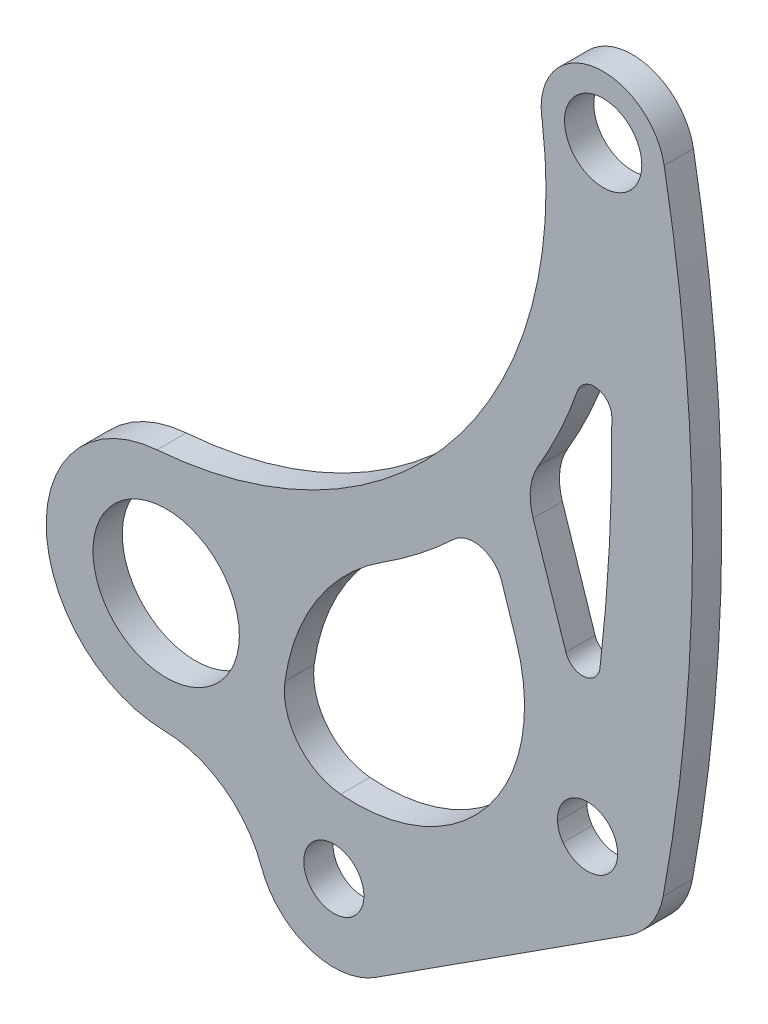
ISO-10303-21;
HEADER;
FILE_DESCRIPTION(('STEP AP214'),'2;1');
FILE_NAME('part.step','',(''),(''),'','','');
FILE_SCHEMA(('AUTOMOTIVE_DESIGN { 1 0 10303 214 1 1 1 1 }'));
ENDSEC;
DATA;
#1=APPLICATION_CONTEXT('core data for automotive mechanical design processes');
#2=APPLICATION_PROTOCOL_DEFINITION('international standard','automotive_design',2000,#1);
#3=PRODUCT_CONTEXT('',#1,'mechanical');
#4=PRODUCT('Part','Part','',(#3));
#5=PRODUCT_RELATED_PRODUCT_CATEGORY('part','',(#4));
#6=PRODUCT_DEFINITION_FORMATION('','',#4);
#7=PRODUCT_DEFINITION_CONTEXT('part definition',#1,'design');
#8=PRODUCT_DEFINITION('design','',#6,#7);
#9=PRODUCT_DEFINITION_SHAPE('','',#8);
#10=(LENGTH_UNIT() NAMED_UNIT(*) SI_UNIT(.MILLI.,.METRE.));
#11=(NAMED_UNIT(*) PLANE_ANGLE_UNIT() SI_UNIT($,.RADIAN.));
#12=(NAMED_UNIT(*) SI_UNIT($,.STERADIAN.) SOLID_ANGLE_UNIT());
#13=UNCERTAINTY_MEASURE_WITH_UNIT(LENGTH_MEASURE(1.E-05),#10,'distance_accuracy_value','');
#14=(GEOMETRIC_REPRESENTATION_CONTEXT(3) GLOBAL_UNCERTAINTY_ASSIGNED_CONTEXT((#13)) GLOBAL_UNIT_ASSIGNED_CONTEXT((#10,
#11,#12)) REPRESENTATION_CONTEXT('',''));
#15=CARTESIAN_POINT('',(0.,0.,0.));
#16=DIRECTION('',(0.,0.,1.));
#17=DIRECTION('',(1.,0.,0.));
#18=AXIS2_PLACEMENT_3D('',#15,#16,#17);
#19=CARTESIAN_POINT('',(-4.50533240745612,58.5644592406378,3.175));
#20=DIRECTION('',(0.,0.,-1.));
#21=DIRECTION('',(-1.,0.,0.));
#22=AXIS2_PLACEMENT_3D('',#19,#20,#21);
#23=CYLINDRICAL_SURFACE('',#22,52.07);
#24=CARTESIAN_POINT('',(-4.50533240745612,58.5644592406378,0.));
#25=DIRECTION('',(0.,0.,1.));
#26=DIRECTION('',(1.,0.,0.));
#27=AXIS2_PLACEMENT_3D('',#24,#25,#26);
#28=CIRCLE('',#27,52.07);
#29=CARTESIAN_POINT('',(23.480081983868,14.6543068684828,0.));
#30=VERTEX_POINT('',#29);
#31=CARTESIAN_POINT('',(31.2033161381692,20.667529034551,0.));
#32=VERTEX_POINT('',#31);
#33=EDGE_CURVE('E382',#30,#32,#28,.T.);
#34=ORIENTED_EDGE('',*,*,#33,.T.);
#35=DIRECTION('',(0.,0.,-1.));
#36=VECTOR('',#35,1.);
#37=CARTESIAN_POINT('',(31.2033161381692,20.667529034551,3.175));
#38=LINE('',#37,#36);
#39=CARTESIAN_POINT('',(31.2033161381692,20.667529034551,3.175));
#40=VERTEX_POINT('',#39);
#41=EDGE_CURVE('E79',#32,#40,#38,.F.);
#42=ORIENTED_EDGE('',*,*,#41,.T.);
#43=CARTESIAN_POINT('',(-4.50533240745612,58.5644592406378,3.175));
#44=DIRECTION('',(0.,0.,1.));
#45=DIRECTION('',(1.,0.,0.));
#46=AXIS2_PLACEMENT_3D('',#43,#44,#45);
#47=CIRCLE('',#46,52.07);
#48=CARTESIAN_POINT('',(23.480081983868,14.6543068684828,3.175));
#49=VERTEX_POINT('',#48);
#50=EDGE_CURVE('E327',#49,#40,#47,.T.);
#51=ORIENTED_EDGE('',*,*,#50,.F.);
#52=DIRECTION('',(0.,0.,1.));
#53=VECTOR('',#52,1.);
#54=CARTESIAN_POINT('',(23.480081983868,14.6543068684828,0.));
#55=LINE('',#54,#53);
#56=EDGE_CURVE('E262',#30,#49,#55,.T.);
#57=ORIENTED_EDGE('',*,*,#56,.F.);
#58=EDGE_LOOP('',(#34,#42,#51,#57));
#59=FACE_BOUND('',#58,.T.);
#60=ADVANCED_FACE('F55',(#59),#23,.T.);
#61=CARTESIAN_POINT('',(45.72,0.,3.175));
#62=DIRECTION('',(0.,0.,-1.));
#63=DIRECTION('',(-1.,0.,0.));
#64=AXIS2_PLACEMENT_3D('',#61,#62,#63);
#65=CYLINDRICAL_SURFACE('',#64,3.2639);
#66=CARTESIAN_POINT('',(45.72,0.,0.));
#67=DIRECTION('',(0.,0.,1.));
#68=DIRECTION('',(1.,0.,0.));
#69=AXIS2_PLACEMENT_3D('',#66,#67,#68);
#70=CIRCLE('',#69,3.2639);
#71=CARTESIAN_POINT('',(42.4625763798194,-0.205510507492002,0.));
#72=VERTEX_POINT('',#71);
#73=CARTESIAN_POINT('',(43.0519360241002,-1.88002069948861,0.));
#74=VERTEX_POINT('',#73);
#75=EDGE_CURVE('E399',#72,#74,#70,.T.);
#76=ORIENTED_EDGE('',*,*,#75,.F.);
#77=DIRECTION('',(0.,0.,1.));
#78=VECTOR('',#77,1.);
#79=CARTESIAN_POINT('',(42.4625763798194,-0.205510507492002,3.175));
#80=LINE('',#79,#78);
#81=CARTESIAN_POINT('',(42.4625763798194,-0.205510507492002,3.175));
#82=VERTEX_POINT('',#81);
#83=EDGE_CURVE('E442',#72,#82,#80,.T.);
#84=ORIENTED_EDGE('',*,*,#83,.T.);
#85=CARTESIAN_POINT('',(45.72,0.,3.175));
#86=DIRECTION('',(0.,0.,1.));
#87=DIRECTION('',(1.,0.,0.));
#88=AXIS2_PLACEMENT_3D('',#85,#86,#87);
#89=CIRCLE('',#88,3.2639);
#90=CARTESIAN_POINT('',(43.0519360241002,-1.88002069948861,3.175));
#91=VERTEX_POINT('',#90);
#92=EDGE_CURVE('E345',#82,#91,#89,.T.);
#93=ORIENTED_EDGE('',*,*,#92,.T.);
#94=DIRECTION('',(0.,0.,1.));
#95=VECTOR('',#94,1.);
#96=CARTESIAN_POINT('',(43.0519360241002,-1.88002069948861,3.175));
#97=LINE('',#96,#95);
#98=EDGE_CURVE('E431',#74,#91,#97,.T.);
#99=ORIENTED_EDGE('',*,*,#98,.F.);
#100=EDGE_LOOP('',(#76,#84,#93,#99));
#101=FACE_BOUND('',#100,.T.);
#102=ADVANCED_FACE('F531',(#101),#65,.F.);
#103=CARTESIAN_POINT('',(48.9774236201806,0.205510507492002,3.175));
#104=VERTEX_POINT('',#103);
#105=EDGE_CURVE('E346',#91,#104,#89,.T.);
#106=ORIENTED_EDGE('',*,*,#105,.T.);
#107=DIRECTION('',(0.,0.,-1.));
#108=VECTOR('',#107,1.);
#109=CARTESIAN_POINT('',(48.9774236201806,0.205510507492002,3.175));
#110=LINE('',#109,#108);
#111=CARTESIAN_POINT('',(48.9774236201806,0.205510507492002,0.));
#112=VERTEX_POINT('',#111);
#113=EDGE_CURVE('E439',#104,#112,#110,.T.);
#114=ORIENTED_EDGE('',*,*,#113,.T.);
#115=EDGE_CURVE('E400',#74,#112,#70,.T.);
#116=ORIENTED_EDGE('',*,*,#115,.F.);
#117=ORIENTED_EDGE('',*,*,#98,.T.);
#118=EDGE_LOOP('',(#106,#114,#116,#117));
#119=FACE_BOUND('',#118,.T.);
#120=ADVANCED_FACE('F538',(#119),#65,.F.);
#121=ORIENTED_EDGE('',*,*,#113,.F.);
#122=CARTESIAN_POINT('',(48.3880639758998,1.88002069948861,3.175));
#123=VERTEX_POINT('',#122);
#124=EDGE_CURVE('E351',#104,#123,#89,.T.);
#125=ORIENTED_EDGE('',*,*,#124,.T.);
#126=DIRECTION('',(0.,0.,-1.));
#127=VECTOR('',#126,1.);
#128=CARTESIAN_POINT('',(48.3880639758998,1.88002069948861,3.175));
#129=LINE('',#128,#127);
#130=CARTESIAN_POINT('',(48.3880639758998,1.88002069948861,0.));
#131=VERTEX_POINT('',#130);
#132=EDGE_CURVE('E435',#123,#131,#129,.T.);
#133=ORIENTED_EDGE('',*,*,#132,.T.);
#134=EDGE_CURVE('E405',#112,#131,#70,.T.);
#135=ORIENTED_EDGE('',*,*,#134,.F.);
#136=EDGE_LOOP('',(#121,#125,#133,#135));
#137=FACE_BOUND('',#136,.T.);
#138=ADVANCED_FACE('F546',(#137),#65,.F.);
#139=CARTESIAN_POINT('',(40.3709543283503,32.1560554871792,3.175));
#140=VERTEX_POINT('',#139);
#141=CARTESIAN_POINT('',(44.646607754843,41.3780786361658,3.175));
#142=VERTEX_POINT('',#141);
#143=EDGE_CURVE('E331',#140,#142,#47,.T.);
#144=ORIENTED_EDGE('',*,*,#143,.F.);
#145=DIRECTION('',(0.,0.,-1.));
#146=VECTOR('',#145,1.);
#147=CARTESIAN_POINT('',(40.3709543283503,32.1560554871792,3.175));
#148=LINE('',#147,#146);
#149=CARTESIAN_POINT('',(40.3709543283503,32.1560554871792,0.));
#150=VERTEX_POINT('',#149);
#151=EDGE_CURVE('E475',#140,#150,#148,.T.);
#152=ORIENTED_EDGE('',*,*,#151,.T.);
#153=CARTESIAN_POINT('',(44.646607754843,41.3780786361658,0.));
#154=VERTEX_POINT('',#153);
#155=EDGE_CURVE('E386',#150,#154,#28,.T.);
#156=ORIENTED_EDGE('',*,*,#155,.T.);
#157=DIRECTION('',(0.,0.,-1.));
#158=VECTOR('',#157,1.);
#159=CARTESIAN_POINT('',(44.646607754843,41.3780786361658,3.175));
#160=LINE('',#159,#158);
#161=EDGE_CURVE('E457',#154,#142,#160,.F.);
#162=ORIENTED_EDGE('',*,*,#161,.T.);
#163=EDGE_LOOP('',(#144,#152,#156,#162));
#164=FACE_BOUND('',#163,.T.);
#165=ADVANCED_FACE('F533',(#164),#23,.T.);
#166=CARTESIAN_POINT('',(-142.138533342949,38.656045003802,3.175));
#167=DIRECTION('',(0.,0.,-1.));
#168=DIRECTION('',(-1.,0.,0.));
#169=AXIS2_PLACEMENT_3D('',#166,#167,#168);
#170=CYLINDRICAL_SURFACE('',#169,190.5);
#171=CARTESIAN_POINT('',(-142.138533342949,38.656045003802,0.));
#172=DIRECTION('',(0.,0.,1.));
#173=DIRECTION('',(1.,0.,0.));
#174=AXIS2_PLACEMENT_3D('',#171,#172,#173);
#175=CIRCLE('',#174,190.5);
#176=CARTESIAN_POINT('',(47.0702030784157,16.5132343910918,0.));
#177=VERTEX_POINT('',#176);
#178=CARTESIAN_POINT('',(48.3497321227549,40.7704526909221,0.));
#179=VERTEX_POINT('',#178);
#180=EDGE_CURVE('E393',#177,#179,#175,.T.);
#181=ORIENTED_EDGE('',*,*,#180,.F.);
#182=DIRECTION('',(0.,0.,-1.));
#183=VECTOR('',#182,1.);
#184=CARTESIAN_POINT('',(47.0702030784158,16.5132343910918,3.175));
#185=LINE('',#184,#183);
#186=CARTESIAN_POINT('',(47.0702030784157,16.5132343910918,3.175));
#187=VERTEX_POINT('',#186);
#188=EDGE_CURVE('E454',#177,#187,#185,.F.);
#189=ORIENTED_EDGE('',*,*,#188,.T.);
#190=CARTESIAN_POINT('',(-142.138533342949,38.656045003802,3.175));
#191=DIRECTION('',(0.,0.,1.));
#192=DIRECTION('',(1.,0.,0.));
#193=AXIS2_PLACEMENT_3D('',#190,#191,#192);
#194=CIRCLE('',#193,190.5);
#195=CARTESIAN_POINT('',(48.3497321227549,40.7704526909221,3.175));
#196=VERTEX_POINT('',#195);
#197=EDGE_CURVE('E338',#187,#196,#194,.T.);
#198=ORIENTED_EDGE('',*,*,#197,.T.);
#199=DIRECTION('',(0.,0.,-1.));
#200=VECTOR('',#199,1.);
#201=CARTESIAN_POINT('',(48.3497321227549,40.7704526909221,3.175));
#202=LINE('',#201,#200);
#203=EDGE_CURVE('E450',#196,#179,#202,.T.);
#204=ORIENTED_EDGE('',*,*,#203,.T.);
#205=EDGE_LOOP('',(#181,#189,#198,#204));
#206=FACE_BOUND('',#205,.T.);
#207=ADVANCED_FACE('F545',(#206),#170,.F.);
#208=CARTESIAN_POINT('',(38.586011370491,12.6938979852854,3.175));
#209=DIRECTION('',(0.949917524329056,0.312500715155272,0.));
#210=DIRECTION('',(-0.312500715155272,0.949917524329057,0.));
#211=AXIS2_PLACEMENT_3D('',#208,#209,#210);
#212=PLANE('',#211);
#213=DIRECTION('',(0.312500715155272,-0.949917524329057,0.));
#214=VECTOR('',#213,1.);
#215=CARTESIAN_POINT('',(38.586011370491,12.6938979852854,3.175));
#216=LINE('',#215,#214);
#217=CARTESIAN_POINT('',(36.3966608965496,19.3489303779686,3.175));
#218=VERTEX_POINT('',#217);
#219=CARTESIAN_POINT('',(37.9672470665697,14.574773859224,3.175));
#220=VERTEX_POINT('',#219);
#221=EDGE_CURVE('E330',#218,#220,#216,.T.);
#222=ORIENTED_EDGE('',*,*,#221,.F.);
#223=DIRECTION('',(0.,0.,1.));
#224=VECTOR('',#223,1.);
#225=CARTESIAN_POINT('',(36.3966608965496,19.3489303779686,0.));
#226=LINE('',#225,#224);
#227=CARTESIAN_POINT('',(36.3966608965496,19.3489303779686,0.));
#228=VERTEX_POINT('',#227);
#229=EDGE_CURVE('E488',#218,#228,#226,.F.);
#230=ORIENTED_EDGE('',*,*,#229,.T.);
#231=DIRECTION('',(0.312500715155272,-0.949917524329057,0.));
#232=VECTOR('',#231,1.);
#233=CARTESIAN_POINT('',(38.586011370491,12.6938979852854,0.));
#234=LINE('',#233,#232);
#235=CARTESIAN_POINT('',(37.9672470665697,14.574773859224,0.));
#236=VERTEX_POINT('',#235);
#237=EDGE_CURVE('E385',#228,#236,#234,.T.);
#238=ORIENTED_EDGE('',*,*,#237,.T.);
#239=DIRECTION('',(0.,0.,1.));
#240=VECTOR('',#239,1.);
#241=CARTESIAN_POINT('',(37.9672470665697,14.574773859224,0.));
#242=LINE('',#241,#240);
#243=EDGE_CURVE('E286',#236,#220,#242,.T.);
#244=ORIENTED_EDGE('',*,*,#243,.T.);
#245=EDGE_LOOP('',(#222,#230,#238,#244));
#246=FACE_BOUND('',#245,.T.);
#247=ADVANCED_FACE('F508',(#246),#212,.F.);
#248=CARTESIAN_POINT('',(-133.393338272466,33.1550421520357,3.175));
#249=DIRECTION('',(0.,0.,-1.));
#250=DIRECTION('',(-1.,0.,0.));
#251=AXIS2_PLACEMENT_3D('',#248,#249,#250);
#252=CYLINDRICAL_SURFACE('',#251,190.5);
#253=CARTESIAN_POINT('',(-133.393338272466,33.1550421520357,0.));
#254=DIRECTION('',(0.,0.,1.));
#255=DIRECTION('',(1.,0.,0.));
#256=AXIS2_PLACEMENT_3D('',#253,#254,#255);
#257=CIRCLE('',#256,190.5);
#258=CARTESIAN_POINT('',(53.9245222927567,-1.51871036002841,0.));
#259=VERTEX_POINT('',#258);
#260=CARTESIAN_POINT('',(54.0358306347205,67.2219857008992,0.));
#261=VERTEX_POINT('',#260);
#262=EDGE_CURVE('E293',#259,#261,#257,.T.);
#263=ORIENTED_EDGE('',*,*,#262,.T.);
#264=DIRECTION('',(0.,0.,-1.));
#265=VECTOR('',#264,1.);
#266=CARTESIAN_POINT('',(54.0358306347205,67.2219857008992,3.175));
#267=LINE('',#266,#265);
#268=CARTESIAN_POINT('',(54.0358306347205,67.2219857008992,3.175));
#269=VERTEX_POINT('',#268);
#270=EDGE_CURVE('E427',#269,#261,#267,.T.);
#271=ORIENTED_EDGE('',*,*,#270,.F.);
#272=CARTESIAN_POINT('',(-133.393338272466,33.1550421520357,3.175));
#273=DIRECTION('',(0.,0.,1.));
#274=DIRECTION('',(1.,0.,0.));
#275=AXIS2_PLACEMENT_3D('',#272,#273,#274);
#276=CIRCLE('',#275,190.5);
#277=CARTESIAN_POINT('',(53.9245222927567,-1.51871036002841,3.175));
#278=VERTEX_POINT('',#277);
#279=EDGE_CURVE('E294',#278,#269,#276,.T.);
#280=ORIENTED_EDGE('',*,*,#279,.F.);
#281=DIRECTION('',(0.,0.,-1.));
#282=VECTOR('',#281,1.);
#283=CARTESIAN_POINT('',(53.9245222927567,-1.51871036002841,3.175));
#284=LINE('',#283,#282);
#285=EDGE_CURVE('E356',#278,#259,#284,.T.);
#286=ORIENTED_EDGE('',*,*,#285,.T.);
#287=EDGE_LOOP('',(#263,#271,#280,#286));
#288=FACE_BOUND('',#287,.T.);
#289=ADVANCED_FACE('F627',(#288),#252,.T.);
#290=CARTESIAN_POINT('',(47.4133333333333,66.0182870288394,3.175));
#291=DIRECTION('',(0.,0.,-1.));
#292=DIRECTION('',(-1.,0.,0.));
#293=AXIS2_PLACEMENT_3D('',#290,#291,#292);
#294=CYLINDRICAL_SURFACE('',#293,6.73099999999993);
#295=CARTESIAN_POINT('',(47.4133333333333,66.0182870288394,0.));
#296=DIRECTION('',(0.,0.,1.));
#297=DIRECTION('',(1.,0.,0.));
#298=AXIS2_PLACEMENT_3D('',#295,#296,#297);
#299=CIRCLE('',#298,6.73099999999993);
#300=CARTESIAN_POINT('',(40.8591949138478,64.4854365539976,0.));
#301=VERTEX_POINT('',#300);
#302=EDGE_CURVE('E360',#261,#301,#299,.T.);
#303=ORIENTED_EDGE('',*,*,#302,.T.);
#304=DIRECTION('',(0.,0.,-1.));
#305=VECTOR('',#304,1.);
#306=CARTESIAN_POINT('',(40.8591949138478,64.4854365539976,3.175));
#307=LINE('',#306,#305);
#308=CARTESIAN_POINT('',(40.8591949138478,64.4854365539976,3.175));
#309=VERTEX_POINT('',#308);
#310=EDGE_CURVE('E424',#309,#301,#307,.T.);
#311=ORIENTED_EDGE('',*,*,#310,.F.);
#312=CARTESIAN_POINT('',(47.4133333333333,66.0182870288394,3.175));
#313=DIRECTION('',(0.,0.,1.));
#314=DIRECTION('',(1.,0.,0.));
#315=AXIS2_PLACEMENT_3D('',#312,#313,#314);
#316=CIRCLE('',#315,6.73099999999993);
#317=EDGE_CURVE('E298',#269,#309,#316,.T.);
#318=ORIENTED_EDGE('',*,*,#317,.F.);
#319=ORIENTED_EDGE('',*,*,#270,.T.);
#320=EDGE_LOOP('',(#303,#311,#318,#319));
#321=FACE_BOUND('',#320,.T.);
#322=ADVANCED_FACE('F647',(#321),#294,.T.);
#323=CARTESIAN_POINT('',(-6.2268221741051,4.92245790861365,3.175));
#324=DIRECTION('',(-0.784481533745524,0.620152177463137,0.));
#325=DIRECTION('',(-0.620152177463137,-0.784481533745524,0.));
#326=AXIS2_PLACEMENT_3D('',#323,#324,#325);
#327=PLANE('',#326);
#328=DIRECTION('',(0.620152177463137,0.784481533745524,0.));
#329=VECTOR('',#328,1.);
#330=CARTESIAN_POINT('',(-6.2268221741051,4.92245790861365,0.));
#331=LINE('',#330,#329);
#332=CARTESIAN_POINT('',(40.8338272840695,64.4533469510919,0.));
#333=VERTEX_POINT('',#332);
#334=EDGE_CURVE('E364',#333,#301,#331,.T.);
#335=ORIENTED_EDGE('',*,*,#334,.F.);
#336=DIRECTION('',(0.,0.,-1.));
#337=VECTOR('',#336,1.);
#338=CARTESIAN_POINT('',(40.8338272840695,64.4533469510919,3.175));
#339=LINE('',#338,#337);
#340=CARTESIAN_POINT('',(40.8338272840695,64.4533469510919,3.175));
#341=VERTEX_POINT('',#340);
#342=EDGE_CURVE('E421',#341,#333,#339,.T.);
#343=ORIENTED_EDGE('',*,*,#342,.F.);
#344=DIRECTION('',(0.620152177463137,0.784481533745524,0.));
#345=VECTOR('',#344,1.);
#346=CARTESIAN_POINT('',(-6.2268221741051,4.92245790861365,3.175));
#347=LINE('',#346,#345);
#348=EDGE_CURVE('E302',#341,#309,#347,.T.);
#349=ORIENTED_EDGE('',*,*,#348,.T.);
#350=ORIENTED_EDGE('',*,*,#310,.T.);
#351=EDGE_LOOP('',(#335,#343,#349,#350));
#352=FACE_BOUND('',#351,.T.);
#353=ADVANCED_FACE('F643',(#352),#327,.T.);
#354=CARTESIAN_POINT('',(-4.50533240745612,58.5644592406378,3.175));
#355=DIRECTION('',(0.,0.,-1.));
#356=DIRECTION('',(-1.,0.,0.));
#357=AXIS2_PLACEMENT_3D('',#354,#355,#356);
#358=CYLINDRICAL_SURFACE('',#357,45.72);
#359=CARTESIAN_POINT('',(-4.50533240745612,58.5644592406378,0.));
#360=DIRECTION('',(0.,0.,1.));
#361=DIRECTION('',(1.,0.,0.));
#362=AXIS2_PLACEMENT_3D('',#359,#360,#361);
#363=CIRCLE('',#362,45.72);
#364=CARTESIAN_POINT('',(-0.99847907408487,12.9791504263035,0.));
#365=VERTEX_POINT('',#364);
#366=EDGE_CURVE('E236',#365,#333,#363,.T.);
#367=ORIENTED_EDGE('',*,*,#366,.F.);
#368=DIRECTION('',(0.,0.,-1.));
#369=VECTOR('',#368,1.);
#370=CARTESIAN_POINT('',(-0.99847907408487,12.9791504263035,3.175));
#371=LINE('',#370,#369);
#372=CARTESIAN_POINT('',(-0.99847907408487,12.9791504263035,3.175));
#373=VERTEX_POINT('',#372);
#374=EDGE_CURVE('E232',#373,#365,#371,.T.);
#375=ORIENTED_EDGE('',*,*,#374,.F.);
#376=CARTESIAN_POINT('',(-4.50533240745612,58.5644592406378,3.175));
#377=DIRECTION('',(0.,0.,1.));
#378=DIRECTION('',(1.,0.,0.));
#379=AXIS2_PLACEMENT_3D('',#376,#377,#378);
#380=CIRCLE('',#379,45.72);
#381=EDGE_CURVE('E306',#373,#341,#380,.T.);
#382=ORIENTED_EDGE('',*,*,#381,.T.);
#383=ORIENTED_EDGE('',*,*,#342,.T.);
#384=EDGE_LOOP('',(#367,#375,#382,#383));
#385=FACE_BOUND('',#384,.T.);
#386=ADVANCED_FACE('F640',(#385),#358,.F.);
#387=CARTESIAN_POINT('',(0.,0.,3.175));
#388=DIRECTION('',(0.,0.,-1.));
#389=DIRECTION('',(-1.,0.,0.));
#390=AXIS2_PLACEMENT_3D('',#387,#388,#389);
#391=CYLINDRICAL_SURFACE('',#390,13.0175);
#392=CARTESIAN_POINT('',(0.,0.,0.));
#393=DIRECTION('',(0.,0.,1.));
#394=DIRECTION('',(1.,0.,0.));
#395=AXIS2_PLACEMENT_3D('',#392,#393,#394);
#396=CIRCLE('',#395,13.0175);
#397=CARTESIAN_POINT('',(-0.196937719498212,-13.0160102099161,0.));
#398=VERTEX_POINT('',#397);
#399=EDGE_CURVE('E226',#365,#398,#396,.T.);
#400=ORIENTED_EDGE('',*,*,#399,.T.);
#401=DIRECTION('',(0.,0.,1.));
#402=VECTOR('',#401,1.);
#403=CARTESIAN_POINT('',(-0.196937719498212,-13.0160102099161,0.));
#404=LINE('',#403,#402);
#405=CARTESIAN_POINT('',(-0.196937719498212,-13.0160102099161,3.175));
#406=VERTEX_POINT('',#405);
#407=EDGE_CURVE('E230',#398,#406,#404,.T.);
#408=ORIENTED_EDGE('',*,*,#407,.T.);
#409=CARTESIAN_POINT('',(0.,0.,3.175));
#410=DIRECTION('',(0.,0.,1.));
#411=DIRECTION('',(1.,0.,0.));
#412=AXIS2_PLACEMENT_3D('',#409,#410,#411);
#413=CIRCLE('',#412,13.0175);
#414=EDGE_CURVE('E310',#373,#406,#413,.T.);
#415=ORIENTED_EDGE('',*,*,#414,.F.);
#416=ORIENTED_EDGE('',*,*,#374,.T.);
#417=EDGE_LOOP('',(#400,#408,#415,#416));
#418=FACE_BOUND('',#417,.T.);
#419=ADVANCED_FACE('F228',(#418),#391,.T.);
#420=CARTESIAN_POINT('',(18.1918286643398,-17.726177530627,3.175));
#421=DIRECTION('',(0.,0.,-1.));
#422=DIRECTION('',(-1.,0.,0.));
#423=AXIS2_PLACEMENT_3D('',#420,#421,#422);
#424=CYLINDRICAL_SURFACE('',#423,8.3439);
#425=CARTESIAN_POINT('',(18.1918286643398,-17.726177530627,0.));
#426=DIRECTION('',(0.,0.,1.));
#427=DIRECTION('',(1.,0.,0.));
#428=AXIS2_PLACEMENT_3D('',#425,#426,#427);
#429=CIRCLE('',#428,8.3439);
#430=CARTESIAN_POINT('',(10.3390654367292,-20.5465989355037,0.));
#431=VERTEX_POINT('',#430);
#432=CARTESIAN_POINT('',(22.7091733526832,-24.7414654204214,0.));
#433=VERTEX_POINT('',#432);
#434=EDGE_CURVE('E71',#431,#433,#429,.T.);
#435=ORIENTED_EDGE('',*,*,#434,.T.);
#436=DIRECTION('',(0.,0.,-1.));
#437=VECTOR('',#436,1.);
#438=CARTESIAN_POINT('',(22.7091733526832,-24.7414654204214,3.175));
#439=LINE('',#438,#437);
#440=CARTESIAN_POINT('',(22.7091733526832,-24.7414654204214,3.175));
#441=VERTEX_POINT('',#440);
#442=EDGE_CURVE('E416',#441,#433,#439,.T.);
#443=ORIENTED_EDGE('',*,*,#442,.F.);
#444=CARTESIAN_POINT('',(18.1918286643398,-17.726177530627,3.175));
#445=DIRECTION('',(0.,0.,1.));
#446=DIRECTION('',(1.,0.,0.));
#447=AXIS2_PLACEMENT_3D('',#444,#445,#446);
#448=CIRCLE('',#447,8.3439);
#449=CARTESIAN_POINT('',(10.3390654367292,-20.5465989355037,3.175));
#450=VERTEX_POINT('',#449);
#451=EDGE_CURVE('E313',#450,#441,#448,.T.);
#452=ORIENTED_EDGE('',*,*,#451,.F.);
#453=DIRECTION('',(0.,0.,1.));
#454=VECTOR('',#453,1.);
#455=CARTESIAN_POINT('',(10.3390654367292,-20.5465989355037,0.));
#456=LINE('',#455,#454);
#457=EDGE_CURVE('E247',#431,#450,#456,.T.);
#458=ORIENTED_EDGE('',*,*,#457,.F.);
#459=EDGE_LOOP('',(#435,#443,#452,#458));
#460=FACE_BOUND('',#459,.T.);
#461=ADVANCED_FACE('F633',(#460),#424,.T.);
#462=CARTESIAN_POINT('',(17.9182611700613,-27.8264709170555,3.175));
#463=DIRECTION('',(0.541394873901105,-0.840768452377708,0.));
#464=DIRECTION('',(0.840768452377708,0.541394873901105,0.));
#465=AXIS2_PLACEMENT_3D('',#462,#463,#464);
#466=PLANE('',#465);
#467=DIRECTION('',(-0.840768452377708,-0.541394873901105,0.));
#468=VECTOR('',#467,1.);
#469=CARTESIAN_POINT('',(17.9182611700613,-27.8264709170555,0.));
#470=LINE('',#469,#468);
#471=CARTESIAN_POINT('',(50.2373446883434,-7.01528788979437,0.));
#472=VERTEX_POINT('',#471);
#473=EDGE_CURVE('E372',#472,#433,#470,.T.);
#474=ORIENTED_EDGE('',*,*,#473,.F.);
#475=DIRECTION('',(0.,0.,-1.));
#476=VECTOR('',#475,1.);
#477=CARTESIAN_POINT('',(50.2373446883434,-7.01528788979437,3.175));
#478=LINE('',#477,#476);
#479=CARTESIAN_POINT('',(50.2373446883434,-7.01528788979437,3.175));
#480=VERTEX_POINT('',#479);
#481=EDGE_CURVE('E413',#480,#472,#478,.T.);
#482=ORIENTED_EDGE('',*,*,#481,.F.);
#483=DIRECTION('',(-0.840768452377708,-0.541394873901105,0.));
#484=VECTOR('',#483,1.);
#485=CARTESIAN_POINT('',(17.9182611700613,-27.8264709170555,3.175));
#486=LINE('',#485,#484);
#487=EDGE_CURVE('E316',#480,#441,#486,.T.);
#488=ORIENTED_EDGE('',*,*,#487,.T.);
#489=ORIENTED_EDGE('',*,*,#442,.T.);
#490=EDGE_LOOP('',(#474,#482,#488,#489));
#491=FACE_BOUND('',#490,.T.);
#492=ADVANCED_FACE('F611',(#491),#466,.T.);
#493=ORIENTED_EDGE('',*,*,#83,.F.);
#494=EDGE_CURVE('E406',#131,#72,#70,.T.);
#495=ORIENTED_EDGE('',*,*,#494,.F.);
#496=ORIENTED_EDGE('',*,*,#132,.F.);
#497=EDGE_CURVE('E352',#123,#82,#89,.T.);
#498=ORIENTED_EDGE('',*,*,#497,.T.);
#499=EDGE_LOOP('',(#493,#495,#496,#498));
#500=FACE_BOUND('',#499,.T.);
#501=ADVANCED_FACE('F541',(#500),#65,.F.);
#502=CARTESIAN_POINT('',(43.9242602583384,14.4500573911322,3.175));
#503=DIRECTION('',(0.949917524329056,0.312500715155273,0.));
#504=DIRECTION('',(-0.312500715155273,0.949917524329056,0.));
#505=AXIS2_PLACEMENT_3D('',#502,#503,#504);
#506=PLANE('',#505);
#507=DIRECTION('',(0.312500715155273,-0.949917524329056,0.));
#508=VECTOR('',#507,1.);
#509=CARTESIAN_POINT('',(43.9242602583384,14.4500573911322,0.));
#510=LINE('',#509,#508);
#511=CARTESIAN_POINT('',(39.8116959434713,26.9511389028385,0.));
#512=VERTEX_POINT('',#511);
#513=CARTESIAN_POINT('',(43.3685228303553,16.1393486348481,0.));
#514=VERTEX_POINT('',#513);
#515=EDGE_CURVE('E397',#512,#514,#510,.T.);
#516=ORIENTED_EDGE('',*,*,#515,.F.);
#517=DIRECTION('',(0.,0.,-1.));
#518=VECTOR('',#517,1.);
#519=CARTESIAN_POINT('',(39.8116959434713,26.9511389028385,3.175));
#520=LINE('',#519,#518);
#521=CARTESIAN_POINT('',(39.8116959434713,26.9511389028385,3.175));
#522=VERTEX_POINT('',#521);
#523=EDGE_CURVE('E479',#512,#522,#520,.F.);
#524=ORIENTED_EDGE('',*,*,#523,.T.);
#525=DIRECTION('',(0.312500715155273,-0.949917524329056,0.));
#526=VECTOR('',#525,1.);
#527=CARTESIAN_POINT('',(43.9242602583384,14.4500573911322,3.175));
#528=LINE('',#527,#526);
#529=CARTESIAN_POINT('',(43.3685228303553,16.1393486348481,3.175));
#530=VERTEX_POINT('',#529);
#531=EDGE_CURVE('E342',#522,#530,#528,.T.);
#532=ORIENTED_EDGE('',*,*,#531,.T.);
#533=DIRECTION('',(0.,0.,1.));
#534=VECTOR('',#533,1.);
#535=CARTESIAN_POINT('',(43.3685228303553,16.1393486348481,0.));
#536=LINE('',#535,#534);
#537=EDGE_CURVE('E446',#530,#514,#536,.F.);
#538=ORIENTED_EDGE('',*,*,#537,.T.);
#539=EDGE_LOOP('',(#516,#524,#532,#538));
#540=FACE_BOUND('',#539,.T.);
#541=ADVANCED_FACE('F572',(#540),#506,.T.);
#542=CARTESIAN_POINT('',(0.,0.,3.175));
#543=DIRECTION('',(0.,0.,-1.));
#544=DIRECTION('',(-1.,0.,0.));
#545=AXIS2_PLACEMENT_3D('',#542,#543,#544);
#546=CYLINDRICAL_SURFACE('',#545,7.9375);
#547=CARTESIAN_POINT('',(0.,0.,3.175));
#548=DIRECTION('',(0.,0.,1.));
#549=DIRECTION('',(1.,0.,0.));
#550=AXIS2_PLACEMENT_3D('',#547,#548,#549);
#551=CIRCLE('',#550,7.9375);
#552=CARTESIAN_POINT('',(7.9375,0.,3.175));
#553=VERTEX_POINT('',#552);
#554=EDGE_CURVE('E334',#553,#553,#551,.T.);
#555=ORIENTED_EDGE('',*,*,#554,.T.);
#556=EDGE_LOOP('',(#555));
#557=FACE_BOUND('',#556,.T.);
#558=CARTESIAN_POINT('',(0.,0.,0.));
#559=DIRECTION('',(0.,0.,1.));
#560=DIRECTION('',(1.,0.,0.));
#561=AXIS2_PLACEMENT_3D('',#558,#559,#560);
#562=CIRCLE('',#561,7.9375);
#563=CARTESIAN_POINT('',(7.9375,0.,0.));
#564=VERTEX_POINT('',#563);
#565=EDGE_CURVE('E389',#564,#564,#562,.T.);
#566=ORIENTED_EDGE('',*,*,#565,.F.);
#567=EDGE_LOOP('',(#566));
#568=FACE_BOUND('',#567,.T.);
#569=ADVANCED_FACE('F613',(#557,#568),#546,.F.);
#570=CARTESIAN_POINT('',(47.4133333333333,66.0182870288394,3.175));
#571=DIRECTION('',(0.,0.,-1.));
#572=DIRECTION('',(-1.,0.,0.));
#573=AXIS2_PLACEMENT_3D('',#570,#571,#572);
#574=CYLINDRICAL_SURFACE('',#573,4.1910000000001);
#575=CARTESIAN_POINT('',(47.4133333333333,66.0182870288394,3.175));
#576=DIRECTION('',(0.,0.,1.));
#577=DIRECTION('',(1.,0.,0.));
#578=AXIS2_PLACEMENT_3D('',#575,#576,#577);
#579=CIRCLE('',#578,4.1910000000001);
#580=CARTESIAN_POINT('',(51.6043333333335,66.0182870288394,3.175));
#581=VERTEX_POINT('',#580);
#582=EDGE_CURVE('E323',#581,#581,#579,.T.);
#583=ORIENTED_EDGE('',*,*,#582,.T.);
#584=EDGE_LOOP('',(#583));
#585=FACE_BOUND('',#584,.T.);
#586=CARTESIAN_POINT('',(47.4133333333333,66.0182870288394,0.));
#587=DIRECTION('',(0.,0.,1.));
#588=DIRECTION('',(1.,0.,0.));
#589=AXIS2_PLACEMENT_3D('',#586,#587,#588);
#590=CIRCLE('',#589,4.1910000000001);
#591=CARTESIAN_POINT('',(51.6043333333335,66.0182870288394,0.));
#592=VERTEX_POINT('',#591);
#593=EDGE_CURVE('E378',#592,#592,#590,.T.);
#594=ORIENTED_EDGE('',*,*,#593,.F.);
#595=EDGE_LOOP('',(#594));
#596=FACE_BOUND('',#595,.T.);
#597=ADVANCED_FACE('F617',(#585,#596),#574,.F.);
#598=CARTESIAN_POINT('',(45.72,0.,3.175));
#599=DIRECTION('',(0.,0.,-1.));
#600=DIRECTION('',(-1.,0.,0.));
#601=AXIS2_PLACEMENT_3D('',#598,#599,#600);
#602=CYLINDRICAL_SURFACE('',#601,8.3439);
#603=CARTESIAN_POINT('',(45.72,0.,0.));
#604=DIRECTION('',(0.,0.,1.));
#605=DIRECTION('',(1.,0.,0.));
#606=AXIS2_PLACEMENT_3D('',#603,#604,#605);
#607=CIRCLE('',#606,8.3439);
#608=EDGE_CURVE('E375',#472,#259,#607,.T.);
#609=ORIENTED_EDGE('',*,*,#608,.T.);
#610=ORIENTED_EDGE('',*,*,#285,.F.);
#611=CARTESIAN_POINT('',(45.72,0.,3.175));
#612=DIRECTION('',(0.,0.,1.));
#613=DIRECTION('',(1.,0.,0.));
#614=AXIS2_PLACEMENT_3D('',#611,#612,#613);
#615=CIRCLE('',#614,8.3439);
#616=EDGE_CURVE('E320',#480,#278,#615,.T.);
#617=ORIENTED_EDGE('',*,*,#616,.F.);
#618=ORIENTED_EDGE('',*,*,#481,.T.);
#619=EDGE_LOOP('',(#609,#610,#617,#618));
#620=FACE_BOUND('',#619,.T.);
#621=ADVANCED_FACE('F597',(#620),#602,.T.);
#622=CARTESIAN_POINT('',(18.1918286643398,-17.726177530627,3.175));
#623=DIRECTION('',(0.,0.,-1.));
#624=DIRECTION('',(-1.,0.,0.));
#625=AXIS2_PLACEMENT_3D('',#622,#623,#624);
#626=CYLINDRICAL_SURFACE('',#625,3.2639);
#627=CARTESIAN_POINT('',(18.1918286643398,-17.726177530627,3.175));
#628=DIRECTION('',(0.,0.,1.));
#629=DIRECTION('',(1.,0.,0.));
#630=AXIS2_PLACEMENT_3D('',#627,#628,#629);
#631=CIRCLE('',#630,3.2639);
#632=CARTESIAN_POINT('',(21.4557286643398,-17.726177530627,3.175));
#633=VERTEX_POINT('',#632);
#634=EDGE_CURVE('E350',#633,#633,#631,.T.);
#635=ORIENTED_EDGE('',*,*,#634,.T.);
#636=EDGE_LOOP('',(#635));
#637=FACE_BOUND('',#636,.T.);
#638=CARTESIAN_POINT('',(18.1918286643398,-17.726177530627,0.));
#639=DIRECTION('',(0.,0.,1.));
#640=DIRECTION('',(1.,0.,0.));
#641=AXIS2_PLACEMENT_3D('',#638,#639,#640);
#642=CIRCLE('',#641,3.2639);
#643=CARTESIAN_POINT('',(21.4557286643398,-17.726177530627,0.));
#644=VERTEX_POINT('',#643);
#645=EDGE_CURVE('E299',#644,#644,#642,.T.);
#646=ORIENTED_EDGE('',*,*,#645,.F.);
#647=EDGE_LOOP('',(#646));
#648=FACE_BOUND('',#647,.T.);
#649=ADVANCED_FACE('F586',(#637,#648),#626,.F.);
#650=CARTESIAN_POINT('',(0.,0.,3.175));
#651=DIRECTION('',(0.,0.,1.));
#652=DIRECTION('',(1.,0.,0.));
#653=AXIS2_PLACEMENT_3D('',#650,#651,#652);
#654=PLANE('',#653);
#655=ORIENTED_EDGE('',*,*,#414,.T.);
#656=CARTESIAN_POINT('',(-0.369069773877424,-24.3925640918348,3.175));
#657=DIRECTION('',(0.,0.,1.));
#658=DIRECTION('',(1.,0.,0.));
#659=AXIS2_PLACEMENT_3D('',#656,#657,#658);
#660=CIRCLE('',#659,11.3778560226585);
#661=EDGE_CURVE('E244',#450,#406,#660,.T.);
#662=ORIENTED_EDGE('',*,*,#661,.F.);
#663=ORIENTED_EDGE('',*,*,#451,.T.);
#664=ORIENTED_EDGE('',*,*,#487,.F.);
#665=ORIENTED_EDGE('',*,*,#616,.T.);
#666=ORIENTED_EDGE('',*,*,#279,.T.);
#667=ORIENTED_EDGE('',*,*,#317,.T.);
#668=ORIENTED_EDGE('',*,*,#348,.F.);
#669=ORIENTED_EDGE('',*,*,#381,.F.);
#670=EDGE_LOOP('',(#655,#662,#663,#664,#665,#666,#667,#668,#669));
#671=FACE_BOUND('',#670,.T.);
#672=CARTESIAN_POINT('',(20.5526651985329,8.84578250101602,3.175));
#673=DIRECTION('',(0.,0.,1.));
#674=DIRECTION('',(1.,0.,0.));
#675=AXIS2_PLACEMENT_3D('',#672,#673,#674);
#676=CIRCLE('',#675,18.3327303918695);
#677=CARTESIAN_POINT('',(18.9302496593564,-9.41501626133866,3.175));
#678=VERTEX_POINT('',#677);
#679=EDGE_CURVE('E281',#678,#220,#676,.T.);
#680=ORIENTED_EDGE('',*,*,#679,.F.);
#681=CARTESIAN_POINT('',(19.5229530139756,-2.7439530083529,3.175));
#682=DIRECTION('',(0.,0.,1.));
#683=DIRECTION('',(1.,0.,0.));
#684=AXIS2_PLACEMENT_3D('',#681,#682,#683);
#685=CIRCLE('',#684,6.69734142715703);
#686=CARTESIAN_POINT('',(12.8907981227458,-1.81180297179721,3.175));
#687=VERTEX_POINT('',#686);
#688=EDGE_CURVE('E270',#687,#678,#685,.T.);
#689=ORIENTED_EDGE('',*,*,#688,.F.);
#690=CARTESIAN_POINT('',(36.0489294684895,-5.06668066004937,3.175));
#691=DIRECTION('',(0.,0.,1.));
#692=DIRECTION('',(1.,0.,0.));
#693=AXIS2_PLACEMENT_3D('',#690,#691,#692);
#694=CIRCLE('',#693,23.3857494254984);
#695=EDGE_CURVE('E261',#49,#687,#694,.T.);
#696=ORIENTED_EDGE('',*,*,#695,.F.);
#697=ORIENTED_EDGE('',*,*,#50,.T.);
#698=CARTESIAN_POINT('',(33.3806727568049,18.3567406073506,3.175));
#699=DIRECTION('',(0.,0.,1.));
#700=DIRECTION('',(1.,0.,0.));
#701=AXIS2_PLACEMENT_3D('',#698,#699,#700);
#702=CIRCLE('',#701,3.175);
#703=EDGE_CURVE('E12',#40,#218,#702,.F.);
#704=ORIENTED_EDGE('',*,*,#703,.T.);
#705=ORIENTED_EDGE('',*,*,#221,.T.);
#706=EDGE_LOOP('',(#680,#689,#696,#697,#704,#705));
#707=FACE_BOUND('',#706,.T.);
#708=ORIENTED_EDGE('',*,*,#582,.F.);
#709=EDGE_LOOP('',(#708));
#710=FACE_BOUND('',#709,.T.);
#711=ORIENTED_EDGE('',*,*,#554,.F.);
#712=EDGE_LOOP('',(#711));
#713=FACE_BOUND('',#712,.T.);
#714=ORIENTED_EDGE('',*,*,#531,.F.);
#715=CARTESIAN_POINT('',(45.8436722229608,28.9355184440745,3.175));
#716=DIRECTION('',(0.,0.,1.));
#717=DIRECTION('',(1.,0.,0.));
#718=AXIS2_PLACEMENT_3D('',#715,#716,#717);
#719=CIRCLE('',#718,6.35);
#720=EDGE_CURVE('E485',#522,#140,#719,.F.);
#721=ORIENTED_EDGE('',*,*,#720,.T.);
#722=ORIENTED_EDGE('',*,*,#143,.T.);
#723=CARTESIAN_POINT('',(46.4448494680978,40.7493086140509,3.175));
#724=DIRECTION('',(0.,0.,1.));
#725=DIRECTION('',(1.,0.,0.));
#726=AXIS2_PLACEMENT_3D('',#723,#724,#725);
#727=CIRCLE('',#726,1.905);
#728=EDGE_CURVE('E472',#142,#196,#727,.F.);
#729=ORIENTED_EDGE('',*,*,#728,.T.);
#730=ORIENTED_EDGE('',*,*,#197,.F.);
#731=CARTESIAN_POINT('',(45.1781157142021,16.7346624972189,3.175));
#732=DIRECTION('',(0.,0.,1.));
#733=DIRECTION('',(1.,0.,0.));
#734=AXIS2_PLACEMENT_3D('',#731,#732,#733);
#735=CIRCLE('',#734,1.905);
#736=EDGE_CURVE('E464',#187,#530,#735,.F.);
#737=ORIENTED_EDGE('',*,*,#736,.T.);
#738=EDGE_LOOP('',(#714,#721,#722,#729,#730,#737));
#739=FACE_BOUND('',#738,.T.);
#740=ORIENTED_EDGE('',*,*,#105,.F.);
#741=ORIENTED_EDGE('',*,*,#92,.F.);
#742=ORIENTED_EDGE('',*,*,#497,.F.);
#743=ORIENTED_EDGE('',*,*,#124,.F.);
#744=EDGE_LOOP('',(#740,#741,#742,#743));
#745=FACE_BOUND('',#744,.T.);
#746=ORIENTED_EDGE('',*,*,#634,.F.);
#747=EDGE_LOOP('',(#746));
#748=FACE_BOUND('',#747,.T.);
#749=ADVANCED_FACE('F504',(#671,#707,#710,#713,#739,#745,#748),#654,.T.);
#750=CARTESIAN_POINT('',(0.,0.,0.));
#751=DIRECTION('',(0.,0.,1.));
#752=DIRECTION('',(1.,0.,0.));
#753=AXIS2_PLACEMENT_3D('',#750,#751,#752);
#754=PLANE('',#753);
#755=CARTESIAN_POINT('',(19.5229530139756,-2.7439530083529,0.));
#756=DIRECTION('',(0.,0.,1.));
#757=DIRECTION('',(1.,0.,0.));
#758=AXIS2_PLACEMENT_3D('',#755,#756,#757);
#759=CIRCLE('',#758,6.69734142715703);
#760=CARTESIAN_POINT('',(12.8907981227458,-1.81180297179721,0.));
#761=VERTEX_POINT('',#760);
#762=CARTESIAN_POINT('',(18.9302496593564,-9.41501626133866,0.));
#763=VERTEX_POINT('',#762);
#764=EDGE_CURVE('E271',#761,#763,#759,.T.);
#765=ORIENTED_EDGE('',*,*,#764,.T.);
#766=CARTESIAN_POINT('',(20.5526651985329,8.84578250101602,0.));
#767=DIRECTION('',(0.,0.,1.));
#768=DIRECTION('',(1.,0.,0.));
#769=AXIS2_PLACEMENT_3D('',#766,#767,#768);
#770=CIRCLE('',#769,18.3327303918695);
#771=EDGE_CURVE('E282',#763,#236,#770,.T.);
#772=ORIENTED_EDGE('',*,*,#771,.T.);
#773=ORIENTED_EDGE('',*,*,#237,.F.);
#774=CARTESIAN_POINT('',(33.3806727568049,18.3567406073506,0.));
#775=DIRECTION('',(0.,0.,1.));
#776=DIRECTION('',(1.,0.,0.));
#777=AXIS2_PLACEMENT_3D('',#774,#775,#776);
#778=CIRCLE('',#777,3.175);
#779=EDGE_CURVE('E64',#228,#32,#778,.T.);
#780=ORIENTED_EDGE('',*,*,#779,.T.);
#781=ORIENTED_EDGE('',*,*,#33,.F.);
#782=CARTESIAN_POINT('',(36.0489294684895,-5.06668066004937,0.));
#783=DIRECTION('',(0.,0.,1.));
#784=DIRECTION('',(1.,0.,0.));
#785=AXIS2_PLACEMENT_3D('',#782,#783,#784);
#786=CIRCLE('',#785,23.3857494254984);
#787=EDGE_CURVE('E265',#30,#761,#786,.T.);
#788=ORIENTED_EDGE('',*,*,#787,.T.);
#789=EDGE_LOOP('',(#765,#772,#773,#780,#781,#788));
#790=FACE_BOUND('',#789,.T.);
#791=CARTESIAN_POINT('',(-0.369069773877424,-24.3925640918348,0.));
#792=DIRECTION('',(0.,0.,1.));
#793=DIRECTION('',(1.,0.,0.));
#794=AXIS2_PLACEMENT_3D('',#791,#792,#793);
#795=CIRCLE('',#794,11.3778560226585);
#796=EDGE_CURVE('E241',#431,#398,#795,.T.);
#797=ORIENTED_EDGE('',*,*,#796,.T.);
#798=ORIENTED_EDGE('',*,*,#399,.F.);
#799=ORIENTED_EDGE('',*,*,#366,.T.);
#800=ORIENTED_EDGE('',*,*,#334,.T.);
#801=ORIENTED_EDGE('',*,*,#302,.F.);
#802=ORIENTED_EDGE('',*,*,#262,.F.);
#803=ORIENTED_EDGE('',*,*,#608,.F.);
#804=ORIENTED_EDGE('',*,*,#473,.T.);
#805=ORIENTED_EDGE('',*,*,#434,.F.);
#806=EDGE_LOOP('',(#797,#798,#799,#800,#801,#802,#803,#804,#805));
#807=FACE_BOUND('',#806,.T.);
#808=ORIENTED_EDGE('',*,*,#593,.T.);
#809=EDGE_LOOP('',(#808));
#810=FACE_BOUND('',#809,.T.);
#811=ORIENTED_EDGE('',*,*,#565,.T.);
#812=EDGE_LOOP('',(#811));
#813=FACE_BOUND('',#812,.T.);
#814=ORIENTED_EDGE('',*,*,#155,.F.);
#815=CARTESIAN_POINT('',(45.8436722229608,28.9355184440745,0.));
#816=DIRECTION('',(0.,0.,1.));
#817=DIRECTION('',(1.,0.,0.));
#818=AXIS2_PLACEMENT_3D('',#815,#816,#817);
#819=CIRCLE('',#818,6.35);
#820=EDGE_CURVE('E482',#150,#512,#819,.T.);
#821=ORIENTED_EDGE('',*,*,#820,.T.);
#822=ORIENTED_EDGE('',*,*,#515,.T.);
#823=CARTESIAN_POINT('',(45.1781157142021,16.7346624972189,0.));
#824=DIRECTION('',(0.,0.,1.));
#825=DIRECTION('',(1.,0.,0.));
#826=AXIS2_PLACEMENT_3D('',#823,#824,#825);
#827=CIRCLE('',#826,1.905);
#828=EDGE_CURVE('E461',#514,#177,#827,.T.);
#829=ORIENTED_EDGE('',*,*,#828,.T.);
#830=ORIENTED_EDGE('',*,*,#180,.T.);
#831=CARTESIAN_POINT('',(46.4448494680978,40.7493086140509,0.));
#832=DIRECTION('',(0.,0.,1.));
#833=DIRECTION('',(1.,0.,0.));
#834=AXIS2_PLACEMENT_3D('',#831,#832,#833);
#835=CIRCLE('',#834,1.905);
#836=EDGE_CURVE('E468',#179,#154,#835,.T.);
#837=ORIENTED_EDGE('',*,*,#836,.T.);
#838=EDGE_LOOP('',(#814,#821,#822,#829,#830,#837));
#839=FACE_BOUND('',#838,.T.);
#840=ORIENTED_EDGE('',*,*,#115,.T.);
#841=ORIENTED_EDGE('',*,*,#134,.T.);
#842=ORIENTED_EDGE('',*,*,#494,.T.);
#843=ORIENTED_EDGE('',*,*,#75,.T.);
#844=EDGE_LOOP('',(#840,#841,#842,#843));
#845=FACE_BOUND('',#844,.T.);
#846=ORIENTED_EDGE('',*,*,#645,.T.);
#847=EDGE_LOOP('',(#846));
#848=FACE_BOUND('',#847,.T.);
#849=ADVANCED_FACE('F249',(#790,#807,#810,#813,#839,#845,#848),#754,.F.);
#850=CARTESIAN_POINT('',(45.1781157142021,16.7346624972189,3.175));
#851=DIRECTION('',(0.,0.,-1.));
#852=DIRECTION('',(-1.,0.,0.));
#853=AXIS2_PLACEMENT_3D('',#850,#851,#852);
#854=CYLINDRICAL_SURFACE('',#853,1.905);
#855=ORIENTED_EDGE('',*,*,#736,.F.);
#856=ORIENTED_EDGE('',*,*,#188,.F.);
#857=ORIENTED_EDGE('',*,*,#828,.F.);
#858=ORIENTED_EDGE('',*,*,#537,.F.);
#859=EDGE_LOOP('',(#855,#856,#857,#858));
#860=FACE_BOUND('',#859,.T.);
#861=ADVANCED_FACE('F577',(#860),#854,.F.);
#862=CARTESIAN_POINT('',(46.4448494680978,40.7493086140509,3.175));
#863=DIRECTION('',(0.,0.,-1.));
#864=DIRECTION('',(-1.,0.,0.));
#865=AXIS2_PLACEMENT_3D('',#862,#863,#864);
#866=CYLINDRICAL_SURFACE('',#865,1.905);
#867=ORIENTED_EDGE('',*,*,#728,.F.);
#868=ORIENTED_EDGE('',*,*,#161,.F.);
#869=ORIENTED_EDGE('',*,*,#836,.F.);
#870=ORIENTED_EDGE('',*,*,#203,.F.);
#871=EDGE_LOOP('',(#867,#868,#869,#870));
#872=FACE_BOUND('',#871,.T.);
#873=ADVANCED_FACE('F583',(#872),#866,.F.);
#874=CARTESIAN_POINT('',(45.8436722229608,28.9355184440745,3.175));
#875=DIRECTION('',(0.,0.,-1.));
#876=DIRECTION('',(-1.,0.,0.));
#877=AXIS2_PLACEMENT_3D('',#874,#875,#876);
#878=CYLINDRICAL_SURFACE('',#877,6.35);
#879=ORIENTED_EDGE('',*,*,#720,.F.);
#880=ORIENTED_EDGE('',*,*,#523,.F.);
#881=ORIENTED_EDGE('',*,*,#820,.F.);
#882=ORIENTED_EDGE('',*,*,#151,.F.);
#883=EDGE_LOOP('',(#879,#880,#881,#882));
#884=FACE_BOUND('',#883,.T.);
#885=ADVANCED_FACE('F565',(#884),#878,.F.);
#886=CARTESIAN_POINT('',(20.5526651985329,8.84578250101602,0.));
#887=DIRECTION('',(0.,0.,1.));
#888=DIRECTION('',(1.,0.,0.));
#889=AXIS2_PLACEMENT_3D('',#886,#887,#888);
#890=CYLINDRICAL_SURFACE('',#889,18.3327303918695);
#891=ORIENTED_EDGE('',*,*,#679,.T.);
#892=ORIENTED_EDGE('',*,*,#243,.F.);
#893=ORIENTED_EDGE('',*,*,#771,.F.);
#894=DIRECTION('',(0.,0.,-1.));
#895=VECTOR('',#894,1.);
#896=CARTESIAN_POINT('',(18.9302496593564,-9.41501626133866,12.065));
#897=LINE('',#896,#895);
#898=EDGE_CURVE('E246',#678,#763,#897,.T.);
#899=ORIENTED_EDGE('',*,*,#898,.F.);
#900=EDGE_LOOP('',(#891,#892,#893,#899));
#901=FACE_BOUND('',#900,.T.);
#902=ADVANCED_FACE('F512',(#901),#890,.F.);
#903=CARTESIAN_POINT('',(19.5229530139756,-2.7439530083529,0.));
#904=DIRECTION('',(0.,0.,1.));
#905=DIRECTION('',(1.,0.,0.));
#906=AXIS2_PLACEMENT_3D('',#903,#904,#905);
#907=CYLINDRICAL_SURFACE('',#906,6.69734142715703);
#908=ORIENTED_EDGE('',*,*,#688,.T.);
#909=ORIENTED_EDGE('',*,*,#898,.T.);
#910=ORIENTED_EDGE('',*,*,#764,.F.);
#911=DIRECTION('',(0.,0.,1.));
#912=VECTOR('',#911,1.);
#913=CARTESIAN_POINT('',(12.8907981227458,-1.81180297179721,0.));
#914=LINE('',#913,#912);
#915=EDGE_CURVE('E275',#761,#687,#914,.T.);
#916=ORIENTED_EDGE('',*,*,#915,.T.);
#917=EDGE_LOOP('',(#908,#909,#910,#916));
#918=FACE_BOUND('',#917,.T.);
#919=ADVANCED_FACE('F515',(#918),#907,.F.);
#920=CARTESIAN_POINT('',(36.0489294684895,-5.06668066004937,0.));
#921=DIRECTION('',(0.,0.,1.));
#922=DIRECTION('',(1.,0.,0.));
#923=AXIS2_PLACEMENT_3D('',#920,#921,#922);
#924=CYLINDRICAL_SURFACE('',#923,23.3857494254984);
#925=ORIENTED_EDGE('',*,*,#695,.T.);
#926=ORIENTED_EDGE('',*,*,#915,.F.);
#927=ORIENTED_EDGE('',*,*,#787,.F.);
#928=ORIENTED_EDGE('',*,*,#56,.T.);
#929=EDGE_LOOP('',(#925,#926,#927,#928));
#930=FACE_BOUND('',#929,.T.);
#931=ADVANCED_FACE('F519',(#930),#924,.F.);
#932=CARTESIAN_POINT('',(33.3806727568049,18.3567406073506,3.175));
#933=DIRECTION('',(0.,0.,-1.));
#934=DIRECTION('',(-1.,0.,0.));
#935=AXIS2_PLACEMENT_3D('',#932,#933,#934);
#936=CYLINDRICAL_SURFACE('',#935,3.175);
#937=ORIENTED_EDGE('',*,*,#703,.F.);
#938=ORIENTED_EDGE('',*,*,#41,.F.);
#939=ORIENTED_EDGE('',*,*,#779,.F.);
#940=ORIENTED_EDGE('',*,*,#229,.F.);
#941=EDGE_LOOP('',(#937,#938,#939,#940));
#942=FACE_BOUND('',#941,.T.);
#943=ADVANCED_FACE('F57',(#942),#936,.F.);
#944=CARTESIAN_POINT('',(-0.369069773877424,-24.3925640918348,0.));
#945=DIRECTION('',(0.,0.,1.));
#946=DIRECTION('',(1.,0.,0.));
#947=AXIS2_PLACEMENT_3D('',#944,#945,#946);
#948=CYLINDRICAL_SURFACE('',#947,11.3778560226585);
#949=ORIENTED_EDGE('',*,*,#661,.T.);
#950=ORIENTED_EDGE('',*,*,#407,.F.);
#951=ORIENTED_EDGE('',*,*,#796,.F.);
#952=ORIENTED_EDGE('',*,*,#457,.T.);
#953=EDGE_LOOP('',(#949,#950,#951,#952));
#954=FACE_BOUND('',#953,.T.);
#955=ADVANCED_FACE('F239',(#954),#948,.F.);
#956=CLOSED_SHELL('',(#60,#102,#120,#138,#165,#207,#247,#289,#322,#353,#386,#419,#461,#492,#501,
#541,#569,#597,#621,#649,#749,#849,#861,#873,#885,#902,#919,#931,#943,#955));
#957=MANIFOLD_SOLID_BREP('B2',#956);
#958=ADVANCED_BREP_SHAPE_REPRESENTATION('',(#18,#957),#14);
#959=SHAPE_DEFINITION_REPRESENTATION(#9,#958);
ENDSEC;
END-ISO-10303-21;
